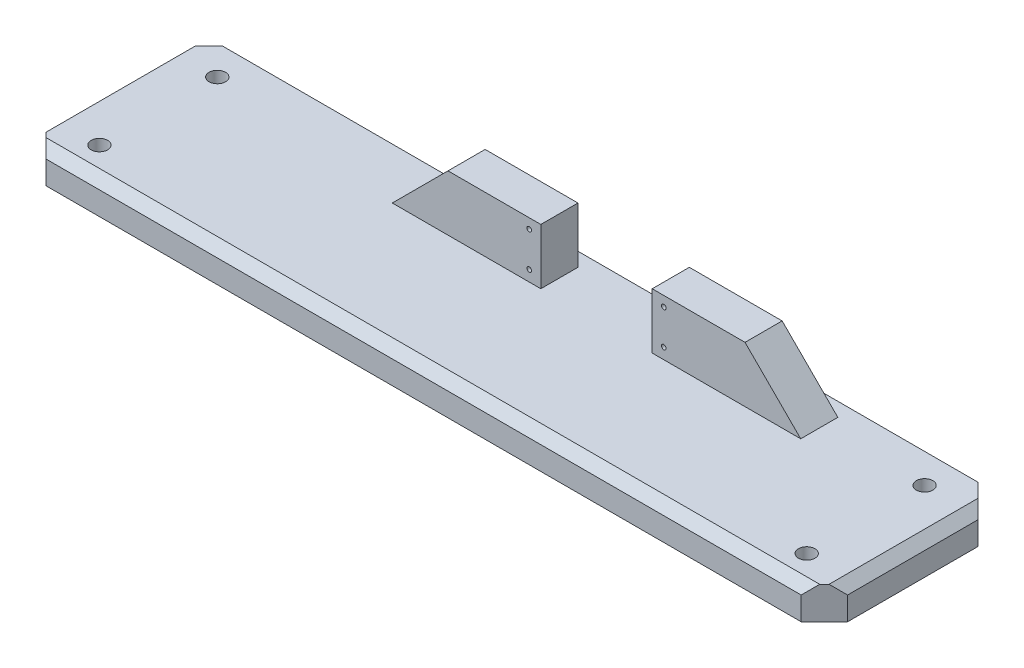
ISO-10303-21;
HEADER;
FILE_DESCRIPTION(('STEP AP214'),'2;1');
FILE_NAME('part.step','',(''),(''),'','','');
FILE_SCHEMA(('AUTOMOTIVE_DESIGN { 1 0 10303 214 1 1 1 1 }'));
ENDSEC;
DATA;
#1=APPLICATION_CONTEXT('core data for automotive mechanical design processes');
#2=APPLICATION_PROTOCOL_DEFINITION('international standard','automotive_design',2000,#1);
#3=PRODUCT_CONTEXT('',#1,'mechanical');
#4=PRODUCT('Part','Part','',(#3));
#5=PRODUCT_RELATED_PRODUCT_CATEGORY('part','',(#4));
#6=PRODUCT_DEFINITION_FORMATION('','',#4);
#7=PRODUCT_DEFINITION_CONTEXT('part definition',#1,'design');
#8=PRODUCT_DEFINITION('design','',#6,#7);
#9=PRODUCT_DEFINITION_SHAPE('','',#8);
#10=(LENGTH_UNIT() NAMED_UNIT(*) SI_UNIT(.MILLI.,.METRE.));
#11=(NAMED_UNIT(*) PLANE_ANGLE_UNIT() SI_UNIT($,.RADIAN.));
#12=(NAMED_UNIT(*) SI_UNIT($,.STERADIAN.) SOLID_ANGLE_UNIT());
#13=UNCERTAINTY_MEASURE_WITH_UNIT(LENGTH_MEASURE(1.E-05),#10,'distance_accuracy_value','');
#14=(GEOMETRIC_REPRESENTATION_CONTEXT(3) GLOBAL_UNCERTAINTY_ASSIGNED_CONTEXT((#13)) GLOBAL_UNIT_ASSIGNED_CONTEXT((#10,
#11,#12)) REPRESENTATION_CONTEXT('',''));
#15=CARTESIAN_POINT('',(0.,0.,0.));
#16=DIRECTION('',(0.,0.,1.));
#17=DIRECTION('',(1.,0.,0.));
#18=AXIS2_PLACEMENT_3D('',#15,#16,#17);
#19=CARTESIAN_POINT('',(0.,7.,0.));
#20=DIRECTION('',(0.,1.,0.));
#21=DIRECTION('',(0.,0.,1.));
#22=AXIS2_PLACEMENT_3D('',#19,#20,#21);
#23=PLANE('',#22);
#24=CARTESIAN_POINT('',(-69.0838657171923,7.,18.7476805696847));
#25=DIRECTION('',(0.,1.,0.));
#26=DIRECTION('',(0.,0.,1.));
#27=AXIS2_PLACEMENT_3D('',#24,#25,#26);
#28=CIRCLE('',#27,1.77800000000001);
#29=CARTESIAN_POINT('',(-69.0838657171923,7.,20.5256805696847));
#30=VERTEX_POINT('',#29);
#31=EDGE_CURVE('E218',#30,#30,#28,.T.);
#32=ORIENTED_EDGE('',*,*,#31,.F.);
#33=EDGE_LOOP('',(#32));
#34=FACE_BOUND('',#33,.T.);
#35=CARTESIAN_POINT('',(83.3161342828077,7.,-6.65231943031537));
#36=DIRECTION('',(0.,1.,0.));
#37=DIRECTION('',(0.,0.,1.));
#38=AXIS2_PLACEMENT_3D('',#35,#36,#37);
#39=CIRCLE('',#38,1.77800000000001);
#40=CARTESIAN_POINT('',(83.3161342828077,7.,-4.87431943031536));
#41=VERTEX_POINT('',#40);
#42=EDGE_CURVE('E222',#41,#41,#39,.T.);
#43=ORIENTED_EDGE('',*,*,#42,.F.);
#44=EDGE_LOOP('',(#43));
#45=FACE_BOUND('',#44,.T.);
#46=CARTESIAN_POINT('',(83.3161342828077,7.,18.7476805696846));
#47=DIRECTION('',(0.,1.,0.));
#48=DIRECTION('',(0.,0.,1.));
#49=AXIS2_PLACEMENT_3D('',#46,#47,#48);
#50=CIRCLE('',#49,1.77800000000001);
#51=CARTESIAN_POINT('',(83.3161342828077,7.,20.5256805696846));
#52=VERTEX_POINT('',#51);
#53=EDGE_CURVE('E217',#52,#52,#50,.T.);
#54=ORIENTED_EDGE('',*,*,#53,.F.);
#55=EDGE_LOOP('',(#54));
#56=FACE_BOUND('',#55,.T.);
#57=CARTESIAN_POINT('',(-69.0838657171923,7.,-6.65231943031536));
#58=DIRECTION('',(0.,1.,0.));
#59=DIRECTION('',(0.,0.,1.));
#60=AXIS2_PLACEMENT_3D('',#57,#58,#59);
#61=CIRCLE('',#60,1.77800000000001);
#62=CARTESIAN_POINT('',(-69.0838657171923,7.,-4.87431943031535));
#63=VERTEX_POINT('',#62);
#64=EDGE_CURVE('E227',#63,#63,#61,.T.);
#65=ORIENTED_EDGE('',*,*,#64,.F.);
#66=EDGE_LOOP('',(#65));
#67=FACE_BOUND('',#66,.T.);
#68=DIRECTION('',(0.,0.,-1.));
#69=VECTOR('',#68,1.);
#70=CARTESIAN_POINT('',(91.4761342828077,7.,-13.0023194303154));
#71=LINE('',#70,#69);
#72=CARTESIAN_POINT('',(91.4761342828077,7.,22.0976805696846));
#73=VERTEX_POINT('',#72);
#74=CARTESIAN_POINT('',(91.4761342828077,7.,-10.0023194303153));
#75=VERTEX_POINT('',#74);
#76=EDGE_CURVE('E276',#73,#75,#71,.T.);
#77=ORIENTED_EDGE('',*,*,#76,.T.);
#78=DIRECTION('',(0.707106781186546,0.,0.707106781186549));
#79=VECTOR('',#78,1.);
#80=CARTESIAN_POINT('',(50.7392268565618,7.,-50.7392268565615));
#81=LINE('',#80,#79);
#82=CARTESIAN_POINT('',(88.4761342828077,7.,-13.0023194303154));
#83=VERTEX_POINT('',#82);
#84=EDGE_CURVE('E315',#75,#83,#81,.F.);
#85=ORIENTED_EDGE('',*,*,#84,.T.);
#86=DIRECTION('',(-1.,0.,0.));
#87=VECTOR('',#86,1.);
#88=CARTESIAN_POINT('',(-79.2438657171923,7.,-13.0023194303154));
#89=LINE('',#88,#87);
#90=CARTESIAN_POINT('',(-74.2438657171923,7.,-13.0023194303154));
#91=VERTEX_POINT('',#90);
#92=EDGE_CURVE('E232',#83,#91,#89,.T.);
#93=ORIENTED_EDGE('',*,*,#92,.T.);
#94=DIRECTION('',(0.707106781186549,0.,-0.707106781186546));
#95=VECTOR('',#94,1.);
#96=CARTESIAN_POINT('',(-43.6230925737536,7.,-43.6230925737539));
#97=LINE('',#96,#95);
#98=CARTESIAN_POINT('',(-77.2438657171923,7.,-10.0023194303154));
#99=VERTEX_POINT('',#98);
#100=EDGE_CURVE('E309',#91,#99,#97,.F.);
#101=ORIENTED_EDGE('',*,*,#100,.T.);
#102=DIRECTION('',(0.,0.,1.));
#103=VECTOR('',#102,1.);
#104=CARTESIAN_POINT('',(-77.2438657171923,7.,25.0976805696846));
#105=LINE('',#104,#103);
#106=CARTESIAN_POINT('',(-77.2438657171923,7.,22.0976805696846));
#107=VERTEX_POINT('',#106);
#108=EDGE_CURVE('E273',#99,#107,#105,.T.);
#109=ORIENTED_EDGE('',*,*,#108,.T.);
#110=DIRECTION('',(-0.707106781186546,0.,-0.707106781186549));
#111=VECTOR('',#110,1.);
#112=CARTESIAN_POINT('',(-49.6707731434387,7.,49.6707731434384));
#113=LINE('',#112,#111);
#114=CARTESIAN_POINT('',(-76.2438657171923,7.,23.0976805696846));
#115=VERTEX_POINT('',#114);
#116=EDGE_CURVE('E311',#107,#115,#113,.F.);
#117=ORIENTED_EDGE('',*,*,#116,.T.);
#118=DIRECTION('',(1.,0.,0.));
#119=VECTOR('',#118,1.);
#120=CARTESIAN_POINT('',(93.4761342828077,7.,23.0976805696846));
#121=LINE('',#120,#119);
#122=CARTESIAN_POINT('',(90.4761342828077,7.,23.0976805696846));
#123=VERTEX_POINT('',#122);
#124=EDGE_CURVE('E270',#115,#123,#121,.T.);
#125=ORIENTED_EDGE('',*,*,#124,.T.);
#126=DIRECTION('',(-0.707106781186549,0.,0.707106781186546));
#127=VECTOR('',#126,1.);
#128=CARTESIAN_POINT('',(56.7869074262459,7.,56.7869074262462));
#129=LINE('',#128,#127);
#130=EDGE_CURVE('E313',#123,#73,#129,.F.);
#131=ORIENTED_EDGE('',*,*,#130,.T.);
#132=EDGE_LOOP('',(#77,#85,#93,#101,#109,#117,#125,#131));
#133=FACE_BOUND('',#132,.T.);
#134=DIRECTION('',(1.,0.,0.));
#135=VECTOR('',#134,1.);
#136=CARTESIAN_POINT('',(-14.7238657171923,7.,-2.00231943031536));
#137=LINE('',#136,#135);
#138=CARTESIAN_POINT('',(-26.7238657171923,7.,-2.00231943031536));
#139=VERTEX_POINT('',#138);
#140=CARTESIAN_POINT('',(5.27613428280772,7.,-2.00231943031536));
#141=VERTEX_POINT('',#140);
#142=EDGE_CURVE('E190',#139,#141,#137,.T.);
#143=ORIENTED_EDGE('',*,*,#142,.F.);
#144=DIRECTION('',(0.,0.,-1.));
#145=VECTOR('',#144,1.);
#146=CARTESIAN_POINT('',(-26.7238657171923,7.,0.));
#147=LINE('',#146,#145);
#148=CARTESIAN_POINT('',(-26.7238657171923,7.,-10.0023194303154));
#149=VERTEX_POINT('',#148);
#150=EDGE_CURVE('E235',#139,#149,#147,.T.);
#151=ORIENTED_EDGE('',*,*,#150,.T.);
#152=DIRECTION('',(-1.,0.,0.));
#153=VECTOR('',#152,1.);
#154=CARTESIAN_POINT('',(-14.7238657171923,7.,-10.0023194303154));
#155=LINE('',#154,#153);
#156=CARTESIAN_POINT('',(5.27613428280771,7.,-10.0023194303154));
#157=VERTEX_POINT('',#156);
#158=EDGE_CURVE('E202',#157,#149,#155,.T.);
#159=ORIENTED_EDGE('',*,*,#158,.F.);
#160=DIRECTION('',(0.,0.,-1.));
#161=VECTOR('',#160,1.);
#162=CARTESIAN_POINT('',(5.27613428280771,7.,-10.0023194303154));
#163=LINE('',#162,#161);
#164=EDGE_CURVE('E193',#141,#157,#163,.T.);
#165=ORIENTED_EDGE('',*,*,#164,.F.);
#166=EDGE_LOOP('',(#143,#151,#159,#165));
#167=FACE_BOUND('',#166,.T.);
#168=DIRECTION('',(-1.,0.,0.));
#169=VECTOR('',#168,1.);
#170=CARTESIAN_POINT('',(29.2761342828077,7.,-10.0023194303154));
#171=LINE('',#170,#169);
#172=CARTESIAN_POINT('',(61.2761342828077,7.,-10.0023194303154));
#173=VERTEX_POINT('',#172);
#174=CARTESIAN_POINT('',(29.2761342828077,7.,-10.0023194303154));
#175=VERTEX_POINT('',#174);
#176=EDGE_CURVE('E184',#173,#175,#171,.T.);
#177=ORIENTED_EDGE('',*,*,#176,.F.);
#178=DIRECTION('',(0.,0.,1.));
#179=VECTOR('',#178,1.);
#180=CARTESIAN_POINT('',(61.2761342828077,7.,0.));
#181=LINE('',#180,#179);
#182=CARTESIAN_POINT('',(61.2761342828077,7.,-2.00231943031536));
#183=VERTEX_POINT('',#182);
#184=EDGE_CURVE('E258',#173,#183,#181,.T.);
#185=ORIENTED_EDGE('',*,*,#184,.T.);
#186=DIRECTION('',(1.,0.,0.));
#187=VECTOR('',#186,1.);
#188=CARTESIAN_POINT('',(29.2761342828077,7.,-2.00231943031536));
#189=LINE('',#188,#187);
#190=CARTESIAN_POINT('',(29.2761342828077,7.,-2.00231943031536));
#191=VERTEX_POINT('',#190);
#192=EDGE_CURVE('E688',#191,#183,#189,.T.);
#193=ORIENTED_EDGE('',*,*,#192,.F.);
#194=DIRECTION('',(0.,0.,1.));
#195=VECTOR('',#194,1.);
#196=CARTESIAN_POINT('',(29.2761342828077,7.,-10.0023194303154));
#197=LINE('',#196,#195);
#198=EDGE_CURVE('E188',#175,#191,#197,.T.);
#199=ORIENTED_EDGE('',*,*,#198,.F.);
#200=EDGE_LOOP('',(#177,#185,#193,#199));
#201=FACE_BOUND('',#200,.T.);
#202=ADVANCED_FACE('F33',(#34,#45,#56,#67,#133,#167,#201),#23,.T.);
#203=CARTESIAN_POINT('',(-79.2438657171923,7.,-13.0023194303154));
#204=DIRECTION('',(1.,0.,0.));
#205=DIRECTION('',(0.,0.,-1.));
#206=AXIS2_PLACEMENT_3D('',#203,#204,#205);
#207=PLANE('',#206);
#208=DIRECTION('',(0.,0.,1.));
#209=VECTOR('',#208,1.);
#210=CARTESIAN_POINT('',(-79.2438657171923,0.,-13.0023194303154));
#211=LINE('',#210,#209);
#212=CARTESIAN_POINT('',(-79.2438657171923,0.,-8.00231943031538));
#213=VERTEX_POINT('',#212);
#214=CARTESIAN_POINT('',(-79.2438657171923,0.,20.0976805696846));
#215=VERTEX_POINT('',#214);
#216=EDGE_CURVE('E237',#213,#215,#211,.T.);
#217=ORIENTED_EDGE('',*,*,#216,.T.);
#218=DIRECTION('',(0.,1.,0.));
#219=VECTOR('',#218,1.);
#220=CARTESIAN_POINT('',(-79.2438657171923,7.,20.0976805696846));
#221=LINE('',#220,#219);
#222=CARTESIAN_POINT('',(-79.2438657171923,5.,20.0976805696846));
#223=VERTEX_POINT('',#222);
#224=EDGE_CURVE('E54',#215,#223,#221,.T.);
#225=ORIENTED_EDGE('',*,*,#224,.T.);
#226=DIRECTION('',(0.,0.,-1.));
#227=VECTOR('',#226,1.);
#228=CARTESIAN_POINT('',(-79.2438657171923,5.,-13.0023194303154));
#229=LINE('',#228,#227);
#230=CARTESIAN_POINT('',(-79.2438657171923,5.,-8.00231943031538));
#231=VERTEX_POINT('',#230);
#232=EDGE_CURVE('E282',#223,#231,#229,.T.);
#233=ORIENTED_EDGE('',*,*,#232,.T.);
#234=DIRECTION('',(0.,-1.,0.));
#235=VECTOR('',#234,1.);
#236=CARTESIAN_POINT('',(-79.2438657171923,7.,-8.00231943031538));
#237=LINE('',#236,#235);
#238=EDGE_CURVE('E326',#231,#213,#237,.T.);
#239=ORIENTED_EDGE('',*,*,#238,.T.);
#240=EDGE_LOOP('',(#217,#225,#233,#239));
#241=FACE_BOUND('',#240,.T.);
#242=ADVANCED_FACE('F331',(#241),#207,.F.);
#243=CARTESIAN_POINT('',(-79.2438657171923,7.,25.0976805696846));
#244=DIRECTION('',(0.,0.,-1.));
#245=DIRECTION('',(-1.,0.,0.));
#246=AXIS2_PLACEMENT_3D('',#243,#244,#245);
#247=PLANE('',#246);
#248=DIRECTION('',(1.,0.,0.));
#249=VECTOR('',#248,1.);
#250=CARTESIAN_POINT('',(-79.2438657171923,0.,25.0976805696846));
#251=LINE('',#250,#249);
#252=CARTESIAN_POINT('',(-74.2438657171923,0.,25.0976805696846));
#253=VERTEX_POINT('',#252);
#254=CARTESIAN_POINT('',(88.4761342828077,0.,25.0976805696846));
#255=VERTEX_POINT('',#254);
#256=EDGE_CURVE('E239',#253,#255,#251,.T.);
#257=ORIENTED_EDGE('',*,*,#256,.T.);
#258=DIRECTION('',(0.,1.,0.));
#259=VECTOR('',#258,1.);
#260=CARTESIAN_POINT('',(88.4761342828077,7.,25.0976805696846));
#261=LINE('',#260,#259);
#262=CARTESIAN_POINT('',(88.4761342828077,5.,25.0976805696846));
#263=VERTEX_POINT('',#262);
#264=EDGE_CURVE('E320',#255,#263,#261,.T.);
#265=ORIENTED_EDGE('',*,*,#264,.T.);
#266=DIRECTION('',(-1.,0.,0.));
#267=VECTOR('',#266,1.);
#268=CARTESIAN_POINT('',(-79.2438657171923,5.,25.0976805696846));
#269=LINE('',#268,#267);
#270=CARTESIAN_POINT('',(-74.2438657171923,5.,25.0976805696846));
#271=VERTEX_POINT('',#270);
#272=EDGE_CURVE('E284',#263,#271,#269,.T.);
#273=ORIENTED_EDGE('',*,*,#272,.T.);
#274=DIRECTION('',(0.,-1.,0.));
#275=VECTOR('',#274,1.);
#276=CARTESIAN_POINT('',(-74.2438657171923,7.,25.0976805696846));
#277=LINE('',#276,#275);
#278=EDGE_CURVE('E317',#271,#253,#277,.T.);
#279=ORIENTED_EDGE('',*,*,#278,.T.);
#280=EDGE_LOOP('',(#257,#265,#273,#279));
#281=FACE_BOUND('',#280,.T.);
#282=ADVANCED_FACE('F343',(#281),#247,.F.);
#283=CARTESIAN_POINT('',(93.4761342828077,7.,-13.0023194303154));
#284=DIRECTION('',(-1.,0.,0.));
#285=DIRECTION('',(0.,0.,1.));
#286=AXIS2_PLACEMENT_3D('',#283,#284,#285);
#287=PLANE('',#286);
#288=DIRECTION('',(0.,0.,-1.));
#289=VECTOR('',#288,1.);
#290=CARTESIAN_POINT('',(93.4761342828077,0.,-13.0023194303154));
#291=LINE('',#290,#289);
#292=CARTESIAN_POINT('',(93.4761342828077,0.,20.0976805696846));
#293=VERTEX_POINT('',#292);
#294=CARTESIAN_POINT('',(93.4761342828077,0.,-8.00231943031533));
#295=VERTEX_POINT('',#294);
#296=EDGE_CURVE('E242',#293,#295,#291,.T.);
#297=ORIENTED_EDGE('',*,*,#296,.T.);
#298=DIRECTION('',(0.,1.,0.));
#299=VECTOR('',#298,1.);
#300=CARTESIAN_POINT('',(93.4761342828077,7.,-8.00231943031533));
#301=LINE('',#300,#299);
#302=CARTESIAN_POINT('',(93.4761342828077,5.,-8.00231943031533));
#303=VERTEX_POINT('',#302);
#304=EDGE_CURVE('E303',#295,#303,#301,.T.);
#305=ORIENTED_EDGE('',*,*,#304,.T.);
#306=DIRECTION('',(0.,0.,1.));
#307=VECTOR('',#306,1.);
#308=CARTESIAN_POINT('',(93.4761342828077,5.,25.0976805696846));
#309=LINE('',#308,#307);
#310=CARTESIAN_POINT('',(93.4761342828077,5.,20.0976805696846));
#311=VERTEX_POINT('',#310);
#312=EDGE_CURVE('E279',#303,#311,#309,.T.);
#313=ORIENTED_EDGE('',*,*,#312,.T.);
#314=DIRECTION('',(0.,-1.,0.));
#315=VECTOR('',#314,1.);
#316=CARTESIAN_POINT('',(93.4761342828077,7.,20.0976805696846));
#317=LINE('',#316,#315);
#318=EDGE_CURVE('E300',#311,#293,#317,.T.);
#319=ORIENTED_EDGE('',*,*,#318,.T.);
#320=EDGE_LOOP('',(#297,#305,#313,#319));
#321=FACE_BOUND('',#320,.T.);
#322=ADVANCED_FACE('F404',(#321),#287,.F.);
#323=CARTESIAN_POINT('',(-79.2438657171923,7.,-13.0023194303154));
#324=DIRECTION('',(0.,0.,1.));
#325=DIRECTION('',(1.,0.,0.));
#326=AXIS2_PLACEMENT_3D('',#323,#324,#325);
#327=PLANE('',#326);
#328=ORIENTED_EDGE('',*,*,#92,.F.);
#329=DIRECTION('',(0.,-1.,0.));
#330=VECTOR('',#329,1.);
#331=CARTESIAN_POINT('',(88.4761342828077,7.,-13.0023194303154));
#332=LINE('',#331,#330);
#333=CARTESIAN_POINT('',(88.4761342828077,0.,-13.0023194303154));
#334=VERTEX_POINT('',#333);
#335=EDGE_CURVE('E289',#83,#334,#332,.T.);
#336=ORIENTED_EDGE('',*,*,#335,.T.);
#337=DIRECTION('',(-1.,0.,0.));
#338=VECTOR('',#337,1.);
#339=CARTESIAN_POINT('',(-79.2438657171923,0.,-13.0023194303154));
#340=LINE('',#339,#338);
#341=CARTESIAN_POINT('',(-74.2438657171923,0.,-13.0023194303154));
#342=VERTEX_POINT('',#341);
#343=EDGE_CURVE('E236',#334,#342,#340,.T.);
#344=ORIENTED_EDGE('',*,*,#343,.T.);
#345=DIRECTION('',(0.,1.,0.));
#346=VECTOR('',#345,1.);
#347=CARTESIAN_POINT('',(-74.2438657171923,7.,-13.0023194303154));
#348=LINE('',#347,#346);
#349=EDGE_CURVE('E287',#342,#91,#348,.T.);
#350=ORIENTED_EDGE('',*,*,#349,.T.);
#351=EDGE_LOOP('',(#328,#336,#344,#350));
#352=FACE_BOUND('',#351,.T.);
#353=ADVANCED_FACE('F370',(#352),#327,.F.);
#354=CARTESIAN_POINT('',(0.,0.,0.));
#355=DIRECTION('',(0.,1.,0.));
#356=DIRECTION('',(0.,0.,1.));
#357=AXIS2_PLACEMENT_3D('',#354,#355,#356);
#358=PLANE('',#357);
#359=CARTESIAN_POINT('',(-69.0838657171923,0.,18.7476805696847));
#360=DIRECTION('',(0.,1.,0.));
#361=DIRECTION('',(0.,0.,1.));
#362=AXIS2_PLACEMENT_3D('',#359,#360,#361);
#363=CIRCLE('',#362,1.77800000000001);
#364=CARTESIAN_POINT('',(-69.0838657171923,0.,20.5256805696847));
#365=VERTEX_POINT('',#364);
#366=EDGE_CURVE('E231',#365,#365,#363,.T.);
#367=ORIENTED_EDGE('',*,*,#366,.T.);
#368=EDGE_LOOP('',(#367));
#369=FACE_BOUND('',#368,.T.);
#370=CARTESIAN_POINT('',(83.3161342828077,0.,-6.65231943031537));
#371=DIRECTION('',(0.,1.,0.));
#372=DIRECTION('',(0.,0.,1.));
#373=AXIS2_PLACEMENT_3D('',#370,#371,#372);
#374=CIRCLE('',#373,1.77800000000001);
#375=CARTESIAN_POINT('',(83.3161342828077,0.,-4.87431943031536));
#376=VERTEX_POINT('',#375);
#377=EDGE_CURVE('E251',#376,#376,#374,.T.);
#378=ORIENTED_EDGE('',*,*,#377,.T.);
#379=EDGE_LOOP('',(#378));
#380=FACE_BOUND('',#379,.T.);
#381=CARTESIAN_POINT('',(83.3161342828077,0.,18.7476805696846));
#382=DIRECTION('',(0.,1.,0.));
#383=DIRECTION('',(0.,0.,1.));
#384=AXIS2_PLACEMENT_3D('',#381,#382,#383);
#385=CIRCLE('',#384,1.77800000000001);
#386=CARTESIAN_POINT('',(83.3161342828077,0.,20.5256805696846));
#387=VERTEX_POINT('',#386);
#388=EDGE_CURVE('E221',#387,#387,#385,.T.);
#389=ORIENTED_EDGE('',*,*,#388,.T.);
#390=EDGE_LOOP('',(#389));
#391=FACE_BOUND('',#390,.T.);
#392=CARTESIAN_POINT('',(-69.0838657171923,0.,-6.65231943031536));
#393=DIRECTION('',(0.,1.,0.));
#394=DIRECTION('',(0.,0.,1.));
#395=AXIS2_PLACEMENT_3D('',#392,#393,#394);
#396=CIRCLE('',#395,1.77800000000001);
#397=CARTESIAN_POINT('',(-69.0838657171923,0.,-4.87431943031535));
#398=VERTEX_POINT('',#397);
#399=EDGE_CURVE('E230',#398,#398,#396,.T.);
#400=ORIENTED_EDGE('',*,*,#399,.T.);
#401=EDGE_LOOP('',(#400));
#402=FACE_BOUND('',#401,.T.);
#403=ORIENTED_EDGE('',*,*,#343,.F.);
#404=DIRECTION('',(-0.707106781186546,0.,-0.707106781186549));
#405=VECTOR('',#404,1.);
#406=CARTESIAN_POINT('',(88.4761342828077,0.,-13.0023194303154));
#407=LINE('',#406,#405);
#408=EDGE_CURVE('E298',#334,#295,#407,.F.);
#409=ORIENTED_EDGE('',*,*,#408,.T.);
#410=ORIENTED_EDGE('',*,*,#296,.F.);
#411=DIRECTION('',(0.707106781186549,0.,-0.707106781186546));
#412=VECTOR('',#411,1.);
#413=CARTESIAN_POINT('',(93.4761342828077,0.,20.0976805696846));
#414=LINE('',#413,#412);
#415=EDGE_CURVE('E296',#293,#255,#414,.F.);
#416=ORIENTED_EDGE('',*,*,#415,.T.);
#417=ORIENTED_EDGE('',*,*,#256,.F.);
#418=DIRECTION('',(0.707106781186546,0.,0.707106781186549));
#419=VECTOR('',#418,1.);
#420=CARTESIAN_POINT('',(-74.2438657171923,0.,25.0976805696846));
#421=LINE('',#420,#419);
#422=EDGE_CURVE('E294',#253,#215,#421,.F.);
#423=ORIENTED_EDGE('',*,*,#422,.T.);
#424=ORIENTED_EDGE('',*,*,#216,.F.);
#425=DIRECTION('',(-0.707106781186549,0.,0.707106781186546));
#426=VECTOR('',#425,1.);
#427=CARTESIAN_POINT('',(-79.2438657171923,0.,-8.00231943031538));
#428=LINE('',#427,#426);
#429=EDGE_CURVE('E292',#213,#342,#428,.F.);
#430=ORIENTED_EDGE('',*,*,#429,.T.);
#431=EDGE_LOOP('',(#403,#409,#410,#416,#417,#423,#424,#430));
#432=FACE_BOUND('',#431,.T.);
#433=ADVANCED_FACE('F335',(#369,#380,#391,#402,#432),#358,.F.);
#434=CARTESIAN_POINT('',(-69.0838657171923,-10.,-6.65231943031536));
#435=DIRECTION('',(0.,1.,0.));
#436=DIRECTION('',(0.,0.,1.));
#437=AXIS2_PLACEMENT_3D('',#434,#435,#436);
#438=CYLINDRICAL_SURFACE('',#437,1.77800000000001);
#439=ORIENTED_EDGE('',*,*,#64,.T.);
#440=EDGE_LOOP('',(#439));
#441=FACE_BOUND('',#440,.T.);
#442=ORIENTED_EDGE('',*,*,#399,.F.);
#443=EDGE_LOOP('',(#442));
#444=FACE_BOUND('',#443,.T.);
#445=ADVANCED_FACE('F397',(#441,#444),#438,.F.);
#446=CARTESIAN_POINT('',(83.3161342828077,-10.,18.7476805696846));
#447=DIRECTION('',(0.,1.,0.));
#448=DIRECTION('',(0.,0.,1.));
#449=AXIS2_PLACEMENT_3D('',#446,#447,#448);
#450=CYLINDRICAL_SURFACE('',#449,1.77800000000001);
#451=ORIENTED_EDGE('',*,*,#53,.T.);
#452=EDGE_LOOP('',(#451));
#453=FACE_BOUND('',#452,.T.);
#454=ORIENTED_EDGE('',*,*,#388,.F.);
#455=EDGE_LOOP('',(#454));
#456=FACE_BOUND('',#455,.T.);
#457=ADVANCED_FACE('F638',(#453,#456),#450,.F.);
#458=CARTESIAN_POINT('',(83.3161342828077,-10.,-6.65231943031537));
#459=DIRECTION('',(0.,1.,0.));
#460=DIRECTION('',(0.,0.,1.));
#461=AXIS2_PLACEMENT_3D('',#458,#459,#460);
#462=CYLINDRICAL_SURFACE('',#461,1.77800000000001);
#463=ORIENTED_EDGE('',*,*,#42,.T.);
#464=EDGE_LOOP('',(#463));
#465=FACE_BOUND('',#464,.T.);
#466=ORIENTED_EDGE('',*,*,#377,.F.);
#467=EDGE_LOOP('',(#466));
#468=FACE_BOUND('',#467,.T.);
#469=ADVANCED_FACE('F628',(#465,#468),#462,.F.);
#470=CARTESIAN_POINT('',(-69.0838657171923,-10.,18.7476805696847));
#471=DIRECTION('',(0.,1.,0.));
#472=DIRECTION('',(0.,0.,1.));
#473=AXIS2_PLACEMENT_3D('',#470,#471,#472);
#474=CYLINDRICAL_SURFACE('',#473,1.77800000000001);
#475=ORIENTED_EDGE('',*,*,#31,.T.);
#476=EDGE_LOOP('',(#475));
#477=FACE_BOUND('',#476,.T.);
#478=ORIENTED_EDGE('',*,*,#366,.F.);
#479=EDGE_LOOP('',(#478));
#480=FACE_BOUND('',#479,.T.);
#481=ADVANCED_FACE('F572',(#477,#480),#474,.F.);
#482=CARTESIAN_POINT('',(-14.7238657171923,19.,-2.00231943031536));
#483=DIRECTION('',(0.,0.,-1.));
#484=DIRECTION('',(-1.,0.,0.));
#485=AXIS2_PLACEMENT_3D('',#482,#483,#484);
#486=PLANE('',#485);
#487=CARTESIAN_POINT('',(2.77613428280771,9.35,-2.00231943031536));
#488=DIRECTION('',(0.,0.,-1.));
#489=DIRECTION('',(-1.,0.,0.));
#490=AXIS2_PLACEMENT_3D('',#487,#488,#489);
#491=CIRCLE('',#490,0.500000000000001);
#492=CARTESIAN_POINT('',(2.27613428280771,9.35,-2.00231943031536));
#493=VERTEX_POINT('',#492);
#494=EDGE_CURVE('E700',#493,#493,#491,.T.);
#495=ORIENTED_EDGE('',*,*,#494,.T.);
#496=EDGE_LOOP('',(#495));
#497=FACE_BOUND('',#496,.T.);
#498=CARTESIAN_POINT('',(2.77613428280771,16.85,-2.00231943031536));
#499=DIRECTION('',(0.,0.,-1.));
#500=DIRECTION('',(-1.,0.,0.));
#501=AXIS2_PLACEMENT_3D('',#498,#499,#500);
#502=CIRCLE('',#501,0.500000000000001);
#503=CARTESIAN_POINT('',(2.27613428280771,16.85,-2.00231943031536));
#504=VERTEX_POINT('',#503);
#505=EDGE_CURVE('E705',#504,#504,#502,.T.);
#506=ORIENTED_EDGE('',*,*,#505,.T.);
#507=EDGE_LOOP('',(#506));
#508=FACE_BOUND('',#507,.T.);
#509=ORIENTED_EDGE('',*,*,#142,.T.);
#510=DIRECTION('',(0.,-1.,0.));
#511=VECTOR('',#510,1.);
#512=CARTESIAN_POINT('',(5.27613428280772,19.,-2.00231943031536));
#513=LINE('',#512,#511);
#514=CARTESIAN_POINT('',(5.27613428280772,19.,-2.00231943031536));
#515=VERTEX_POINT('',#514);
#516=EDGE_CURVE('E214',#515,#141,#513,.T.);
#517=ORIENTED_EDGE('',*,*,#516,.F.);
#518=DIRECTION('',(1.,0.,0.));
#519=VECTOR('',#518,1.);
#520=CARTESIAN_POINT('',(-14.7238657171923,19.,-2.00231943031536));
#521=LINE('',#520,#519);
#522=CARTESIAN_POINT('',(-14.7238657171923,19.,-2.00231943031536));
#523=VERTEX_POINT('',#522);
#524=EDGE_CURVE('E201',#523,#515,#521,.T.);
#525=ORIENTED_EDGE('',*,*,#524,.F.);
#526=DIRECTION('',(-0.707106781186543,-0.707106781186552,0.));
#527=VECTOR('',#526,1.);
#528=CARTESIAN_POINT('',(-14.7238657171923,19.0000000000001,-2.00231943031536));
#529=LINE('',#528,#527);
#530=EDGE_CURVE('E265',#523,#139,#529,.T.);
#531=ORIENTED_EDGE('',*,*,#530,.T.);
#532=EDGE_LOOP('',(#509,#517,#525,#531));
#533=FACE_BOUND('',#532,.T.);
#534=ADVANCED_FACE('F568',(#497,#508,#533),#486,.F.);
#535=CARTESIAN_POINT('',(5.27613428280771,19.,-10.0023194303154));
#536=DIRECTION('',(-1.,0.,0.));
#537=DIRECTION('',(0.,0.,1.));
#538=AXIS2_PLACEMENT_3D('',#535,#536,#537);
#539=PLANE('',#538);
#540=ORIENTED_EDGE('',*,*,#164,.T.);
#541=DIRECTION('',(0.,-1.,0.));
#542=VECTOR('',#541,1.);
#543=CARTESIAN_POINT('',(5.27613428280771,19.,-10.0023194303154));
#544=LINE('',#543,#542);
#545=CARTESIAN_POINT('',(5.27613428280771,19.,-10.0023194303154));
#546=VERTEX_POINT('',#545);
#547=EDGE_CURVE('E208',#546,#157,#544,.T.);
#548=ORIENTED_EDGE('',*,*,#547,.F.);
#549=DIRECTION('',(0.,0.,-1.));
#550=VECTOR('',#549,1.);
#551=CARTESIAN_POINT('',(5.27613428280771,19.,-10.0023194303154));
#552=LINE('',#551,#550);
#553=EDGE_CURVE('E204',#515,#546,#552,.T.);
#554=ORIENTED_EDGE('',*,*,#553,.F.);
#555=ORIENTED_EDGE('',*,*,#516,.T.);
#556=EDGE_LOOP('',(#540,#548,#554,#555));
#557=FACE_BOUND('',#556,.T.);
#558=ADVANCED_FACE('F560',(#557),#539,.F.);
#559=CARTESIAN_POINT('',(-14.7238657171923,19.,-10.0023194303154));
#560=DIRECTION('',(0.,0.,1.));
#561=DIRECTION('',(1.,0.,0.));
#562=AXIS2_PLACEMENT_3D('',#559,#560,#561);
#563=PLANE('',#562);
#564=CARTESIAN_POINT('',(2.77613428280771,9.35,-10.0023194303154));
#565=DIRECTION('',(0.,0.,-1.));
#566=DIRECTION('',(-1.,0.,0.));
#567=AXIS2_PLACEMENT_3D('',#564,#565,#566);
#568=CIRCLE('',#567,0.500000000000001);
#569=CARTESIAN_POINT('',(2.27613428280771,9.35,-10.0023194303154));
#570=VERTEX_POINT('',#569);
#571=EDGE_CURVE('E715',#570,#570,#568,.T.);
#572=ORIENTED_EDGE('',*,*,#571,.F.);
#573=EDGE_LOOP('',(#572));
#574=FACE_BOUND('',#573,.T.);
#575=CARTESIAN_POINT('',(2.77613428280771,16.85,-10.0023194303154));
#576=DIRECTION('',(0.,0.,-1.));
#577=DIRECTION('',(-1.,0.,0.));
#578=AXIS2_PLACEMENT_3D('',#575,#576,#577);
#579=CIRCLE('',#578,0.500000000000001);
#580=CARTESIAN_POINT('',(2.27613428280771,16.85,-10.0023194303154));
#581=VERTEX_POINT('',#580);
#582=EDGE_CURVE('E712',#581,#581,#579,.T.);
#583=ORIENTED_EDGE('',*,*,#582,.F.);
#584=EDGE_LOOP('',(#583));
#585=FACE_BOUND('',#584,.T.);
#586=ORIENTED_EDGE('',*,*,#158,.T.);
#587=DIRECTION('',(0.707106781186543,0.707106781186552,0.));
#588=VECTOR('',#587,1.);
#589=CARTESIAN_POINT('',(-14.7238657171923,19.0000000000001,-10.0023194303154));
#590=LINE('',#589,#588);
#591=CARTESIAN_POINT('',(-14.7238657171923,19.,-10.0023194303154));
#592=VERTEX_POINT('',#591);
#593=EDGE_CURVE('E268',#149,#592,#590,.T.);
#594=ORIENTED_EDGE('',*,*,#593,.T.);
#595=DIRECTION('',(-1.,0.,0.));
#596=VECTOR('',#595,1.);
#597=CARTESIAN_POINT('',(-14.7238657171923,19.,-10.0023194303154));
#598=LINE('',#597,#596);
#599=EDGE_CURVE('E206',#546,#592,#598,.T.);
#600=ORIENTED_EDGE('',*,*,#599,.F.);
#601=ORIENTED_EDGE('',*,*,#547,.T.);
#602=EDGE_LOOP('',(#586,#594,#600,#601));
#603=FACE_BOUND('',#602,.T.);
#604=ADVANCED_FACE('F550',(#574,#585,#603),#563,.F.);
#605=CARTESIAN_POINT('',(0.,19.,0.));
#606=DIRECTION('',(0.,1.,0.));
#607=DIRECTION('',(0.,0.,1.));
#608=AXIS2_PLACEMENT_3D('',#605,#606,#607);
#609=PLANE('',#608);
#610=DIRECTION('',(0.,0.,1.));
#611=VECTOR('',#610,1.);
#612=CARTESIAN_POINT('',(-14.7238657171923,19.,-10.0023194303154));
#613=LINE('',#612,#611);
#614=EDGE_CURVE('E198',#592,#523,#613,.T.);
#615=ORIENTED_EDGE('',*,*,#614,.T.);
#616=ORIENTED_EDGE('',*,*,#524,.T.);
#617=ORIENTED_EDGE('',*,*,#553,.T.);
#618=ORIENTED_EDGE('',*,*,#599,.T.);
#619=EDGE_LOOP('',(#615,#616,#617,#618));
#620=FACE_BOUND('',#619,.T.);
#621=ADVANCED_FACE('F545',(#620),#609,.T.);
#622=CARTESIAN_POINT('',(29.2761342828077,19.,-10.0023194303154));
#623=DIRECTION('',(1.,0.,0.));
#624=DIRECTION('',(0.,0.,-1.));
#625=AXIS2_PLACEMENT_3D('',#622,#623,#624);
#626=PLANE('',#625);
#627=ORIENTED_EDGE('',*,*,#198,.T.);
#628=DIRECTION('',(0.,-1.,0.));
#629=VECTOR('',#628,1.);
#630=CARTESIAN_POINT('',(29.2761342828077,19.,-2.00231943031536));
#631=LINE('',#630,#629);
#632=CARTESIAN_POINT('',(29.2761342828077,19.,-2.00231943031536));
#633=VERTEX_POINT('',#632);
#634=EDGE_CURVE('E167',#633,#191,#631,.T.);
#635=ORIENTED_EDGE('',*,*,#634,.F.);
#636=DIRECTION('',(0.,0.,1.));
#637=VECTOR('',#636,1.);
#638=CARTESIAN_POINT('',(29.2761342828077,19.,-10.0023194303154));
#639=LINE('',#638,#637);
#640=CARTESIAN_POINT('',(29.2761342828077,19.,-10.0023194303154));
#641=VERTEX_POINT('',#640);
#642=EDGE_CURVE('E175',#641,#633,#639,.T.);
#643=ORIENTED_EDGE('',*,*,#642,.F.);
#644=DIRECTION('',(0.,-1.,0.));
#645=VECTOR('',#644,1.);
#646=CARTESIAN_POINT('',(29.2761342828077,19.,-10.0023194303154));
#647=LINE('',#646,#645);
#648=EDGE_CURVE('E191',#641,#175,#647,.T.);
#649=ORIENTED_EDGE('',*,*,#648,.T.);
#650=EDGE_LOOP('',(#627,#635,#643,#649));
#651=FACE_BOUND('',#650,.T.);
#652=ADVANCED_FACE('F186',(#651),#626,.F.);
#653=CARTESIAN_POINT('',(29.2761342828077,19.,-2.00231943031536));
#654=DIRECTION('',(0.,0.,-1.));
#655=DIRECTION('',(-1.,0.,0.));
#656=AXIS2_PLACEMENT_3D('',#653,#654,#655);
#657=PLANE('',#656);
#658=CARTESIAN_POINT('',(31.7761342828077,9.35,-2.00231943031536));
#659=DIRECTION('',(0.,0.,-1.));
#660=DIRECTION('',(-1.,0.,0.));
#661=AXIS2_PLACEMENT_3D('',#658,#659,#660);
#662=CIRCLE('',#661,0.499999999999999);
#663=CARTESIAN_POINT('',(31.2761342828077,9.35,-2.00231943031536));
#664=VERTEX_POINT('',#663);
#665=EDGE_CURVE('E708',#664,#664,#662,.T.);
#666=ORIENTED_EDGE('',*,*,#665,.T.);
#667=EDGE_LOOP('',(#666));
#668=FACE_BOUND('',#667,.T.);
#669=CARTESIAN_POINT('',(31.7761342828077,16.85,-2.00231943031536));
#670=DIRECTION('',(0.,0.,-1.));
#671=DIRECTION('',(-1.,0.,0.));
#672=AXIS2_PLACEMENT_3D('',#669,#670,#671);
#673=CIRCLE('',#672,0.499999999999999);
#674=CARTESIAN_POINT('',(31.2761342828077,16.85,-2.00231943031536));
#675=VERTEX_POINT('',#674);
#676=EDGE_CURVE('E693',#675,#675,#673,.T.);
#677=ORIENTED_EDGE('',*,*,#676,.T.);
#678=EDGE_LOOP('',(#677));
#679=FACE_BOUND('',#678,.T.);
#680=ORIENTED_EDGE('',*,*,#192,.T.);
#681=DIRECTION('',(-0.707106781186543,0.707106781186552,0.));
#682=VECTOR('',#681,1.);
#683=CARTESIAN_POINT('',(39.2761342828079,29.0000000000001,-2.00231943031536));
#684=LINE('',#683,#682);
#685=CARTESIAN_POINT('',(49.2761342828077,19.,-2.00231943031536));
#686=VERTEX_POINT('',#685);
#687=EDGE_CURVE('E170',#183,#686,#684,.T.);
#688=ORIENTED_EDGE('',*,*,#687,.T.);
#689=DIRECTION('',(1.,0.,0.));
#690=VECTOR('',#689,1.);
#691=CARTESIAN_POINT('',(29.2761342828077,19.,-2.00231943031536));
#692=LINE('',#691,#690);
#693=EDGE_CURVE('E163',#633,#686,#692,.T.);
#694=ORIENTED_EDGE('',*,*,#693,.F.);
#695=ORIENTED_EDGE('',*,*,#634,.T.);
#696=EDGE_LOOP('',(#680,#688,#694,#695));
#697=FACE_BOUND('',#696,.T.);
#698=ADVANCED_FACE('F165',(#668,#679,#697),#657,.F.);
#699=CARTESIAN_POINT('',(29.2761342828077,19.,-10.0023194303154));
#700=DIRECTION('',(0.,0.,1.));
#701=DIRECTION('',(1.,0.,0.));
#702=AXIS2_PLACEMENT_3D('',#699,#700,#701);
#703=PLANE('',#702);
#704=CARTESIAN_POINT('',(31.7761342828077,9.35,-10.0023194303154));
#705=DIRECTION('',(0.,0.,-1.));
#706=DIRECTION('',(-1.,0.,0.));
#707=AXIS2_PLACEMENT_3D('',#704,#705,#706);
#708=CIRCLE('',#707,0.499999999999999);
#709=CARTESIAN_POINT('',(31.2761342828077,9.35,-10.0023194303154));
#710=VERTEX_POINT('',#709);
#711=EDGE_CURVE('E711',#710,#710,#708,.T.);
#712=ORIENTED_EDGE('',*,*,#711,.F.);
#713=EDGE_LOOP('',(#712));
#714=FACE_BOUND('',#713,.T.);
#715=CARTESIAN_POINT('',(31.7761342828077,16.85,-10.0023194303154));
#716=DIRECTION('',(0.,0.,-1.));
#717=DIRECTION('',(-1.,0.,0.));
#718=AXIS2_PLACEMENT_3D('',#715,#716,#717);
#719=CIRCLE('',#718,0.499999999999999);
#720=CARTESIAN_POINT('',(31.2761342828077,16.85,-10.0023194303154));
#721=VERTEX_POINT('',#720);
#722=EDGE_CURVE('E695',#721,#721,#719,.T.);
#723=ORIENTED_EDGE('',*,*,#722,.F.);
#724=EDGE_LOOP('',(#723));
#725=FACE_BOUND('',#724,.T.);
#726=ORIENTED_EDGE('',*,*,#176,.T.);
#727=ORIENTED_EDGE('',*,*,#648,.F.);
#728=DIRECTION('',(-1.,0.,0.));
#729=VECTOR('',#728,1.);
#730=CARTESIAN_POINT('',(29.2761342828077,19.,-10.0023194303154));
#731=LINE('',#730,#729);
#732=CARTESIAN_POINT('',(49.2761342828077,19.,-10.0023194303154));
#733=VERTEX_POINT('',#732);
#734=EDGE_CURVE('E180',#733,#641,#731,.T.);
#735=ORIENTED_EDGE('',*,*,#734,.F.);
#736=DIRECTION('',(0.707106781186543,-0.707106781186552,0.));
#737=VECTOR('',#736,1.);
#738=CARTESIAN_POINT('',(39.2761342828079,29.0000000000001,-10.0023194303154));
#739=LINE('',#738,#737);
#740=EDGE_CURVE('E261',#733,#173,#739,.T.);
#741=ORIENTED_EDGE('',*,*,#740,.T.);
#742=EDGE_LOOP('',(#726,#727,#735,#741));
#743=FACE_BOUND('',#742,.T.);
#744=ADVANCED_FACE('F518',(#714,#725,#743),#703,.F.);
#745=CARTESIAN_POINT('',(0.,19.,0.));
#746=DIRECTION('',(0.,1.,0.));
#747=DIRECTION('',(0.,0.,1.));
#748=AXIS2_PLACEMENT_3D('',#745,#746,#747);
#749=PLANE('',#748);
#750=ORIENTED_EDGE('',*,*,#642,.T.);
#751=ORIENTED_EDGE('',*,*,#693,.T.);
#752=DIRECTION('',(0.,0.,-1.));
#753=VECTOR('',#752,1.);
#754=CARTESIAN_POINT('',(49.2761342828077,19.,-10.0023194303154));
#755=LINE('',#754,#753);
#756=EDGE_CURVE('E174',#686,#733,#755,.T.);
#757=ORIENTED_EDGE('',*,*,#756,.T.);
#758=ORIENTED_EDGE('',*,*,#734,.T.);
#759=EDGE_LOOP('',(#750,#751,#757,#758));
#760=FACE_BOUND('',#759,.T.);
#761=ADVANCED_FACE('F178',(#760),#749,.T.);
#762=CARTESIAN_POINT('',(31.7761342828077,16.85,-0.00231943031535863));
#763=DIRECTION('',(0.,0.,-1.));
#764=DIRECTION('',(-1.,0.,0.));
#765=AXIS2_PLACEMENT_3D('',#762,#763,#764);
#766=CYLINDRICAL_SURFACE('',#765,0.499999999999999);
#767=ORIENTED_EDGE('',*,*,#722,.T.);
#768=EDGE_LOOP('',(#767));
#769=FACE_BOUND('',#768,.T.);
#770=ORIENTED_EDGE('',*,*,#676,.F.);
#771=EDGE_LOOP('',(#770));
#772=FACE_BOUND('',#771,.T.);
#773=ADVANCED_FACE('F517',(#769,#772),#766,.F.);
#774=CARTESIAN_POINT('',(31.7761342828077,9.35,-0.00231943031535863));
#775=DIRECTION('',(0.,0.,-1.));
#776=DIRECTION('',(-1.,0.,0.));
#777=AXIS2_PLACEMENT_3D('',#774,#775,#776);
#778=CYLINDRICAL_SURFACE('',#777,0.499999999999999);
#779=ORIENTED_EDGE('',*,*,#711,.T.);
#780=EDGE_LOOP('',(#779));
#781=FACE_BOUND('',#780,.T.);
#782=ORIENTED_EDGE('',*,*,#665,.F.);
#783=EDGE_LOOP('',(#782));
#784=FACE_BOUND('',#783,.T.);
#785=ADVANCED_FACE('F591',(#781,#784),#778,.F.);
#786=CARTESIAN_POINT('',(2.77613428280771,16.85,-0.00231943031535863));
#787=DIRECTION('',(0.,0.,-1.));
#788=DIRECTION('',(-1.,0.,0.));
#789=AXIS2_PLACEMENT_3D('',#786,#787,#788);
#790=CYLINDRICAL_SURFACE('',#789,0.500000000000001);
#791=ORIENTED_EDGE('',*,*,#582,.T.);
#792=EDGE_LOOP('',(#791));
#793=FACE_BOUND('',#792,.T.);
#794=ORIENTED_EDGE('',*,*,#505,.F.);
#795=EDGE_LOOP('',(#794));
#796=FACE_BOUND('',#795,.T.);
#797=ADVANCED_FACE('F581',(#793,#796),#790,.F.);
#798=CARTESIAN_POINT('',(2.77613428280771,9.35,-0.00231943031535863));
#799=DIRECTION('',(0.,0.,-1.));
#800=DIRECTION('',(-1.,0.,0.));
#801=AXIS2_PLACEMENT_3D('',#798,#799,#800);
#802=CYLINDRICAL_SURFACE('',#801,0.500000000000001);
#803=ORIENTED_EDGE('',*,*,#571,.T.);
#804=EDGE_LOOP('',(#803));
#805=FACE_BOUND('',#804,.T.);
#806=ORIENTED_EDGE('',*,*,#494,.F.);
#807=EDGE_LOOP('',(#806));
#808=FACE_BOUND('',#807,.T.);
#809=ADVANCED_FACE('F411',(#805,#808),#802,.F.);
#810=CARTESIAN_POINT('',(49.2761342828077,19.0000000000001,-10.0023194303154));
#811=DIRECTION('',(-0.707106781186552,-0.707106781186543,0.));
#812=DIRECTION('',(0.,0.,-1.));
#813=AXIS2_PLACEMENT_3D('',#810,#811,#812);
#814=PLANE('',#813);
#815=ORIENTED_EDGE('',*,*,#687,.F.);
#816=ORIENTED_EDGE('',*,*,#184,.F.);
#817=ORIENTED_EDGE('',*,*,#740,.F.);
#818=ORIENTED_EDGE('',*,*,#756,.F.);
#819=EDGE_LOOP('',(#815,#816,#817,#818));
#820=FACE_BOUND('',#819,.T.);
#821=ADVANCED_FACE('F382',(#820),#814,.F.);
#822=CARTESIAN_POINT('',(-14.7238657171923,19.0000000000001,-10.0023194303154));
#823=DIRECTION('',(0.707106781186552,-0.707106781186543,0.));
#824=DIRECTION('',(0.,0.,1.));
#825=AXIS2_PLACEMENT_3D('',#822,#823,#824);
#826=PLANE('',#825);
#827=ORIENTED_EDGE('',*,*,#593,.F.);
#828=ORIENTED_EDGE('',*,*,#150,.F.);
#829=ORIENTED_EDGE('',*,*,#530,.F.);
#830=ORIENTED_EDGE('',*,*,#614,.F.);
#831=EDGE_LOOP('',(#827,#828,#829,#830));
#832=FACE_BOUND('',#831,.T.);
#833=ADVANCED_FACE('F375',(#832),#826,.F.);
#834=CARTESIAN_POINT('',(-77.2438657171923,7.,0.));
#835=DIRECTION('',(-0.707106781186547,0.707106781186547,0.));
#836=DIRECTION('',(0.,0.,-1.));
#837=AXIS2_PLACEMENT_3D('',#834,#835,#836);
#838=PLANE('',#837);
#839=ORIENTED_EDGE('',*,*,#232,.F.);
#840=DIRECTION('',(-0.577350269189625,-0.577350269189625,-0.577350269189628));
#841=VECTOR('',#840,1.);
#842=CARTESIAN_POINT('',(-84.6097592404205,-0.365893523228222,14.7317870464564));
#843=LINE('',#842,#841);
#844=EDGE_CURVE('E11',#223,#107,#843,.F.);
#845=ORIENTED_EDGE('',*,*,#844,.T.);
#846=ORIENTED_EDGE('',*,*,#108,.F.);
#847=DIRECTION('',(0.577350269189627,0.577350269189627,-0.577350269189624));
#848=VECTOR('',#847,1.);
#849=CARTESIAN_POINT('',(-80.577972193964,3.66589352322822,-6.66821295354361));
#850=LINE('',#849,#848);
#851=EDGE_CURVE('E41',#99,#231,#850,.F.);
#852=ORIENTED_EDGE('',*,*,#851,.T.);
#853=EDGE_LOOP('',(#839,#845,#846,#852));
#854=FACE_BOUND('',#853,.T.);
#855=ADVANCED_FACE('F373',(#854),#838,.T.);
#856=CARTESIAN_POINT('',(0.,7.,23.0976805696846));
#857=DIRECTION('',(0.,0.707106781186547,0.707106781186547));
#858=DIRECTION('',(-1.,0.,0.));
#859=AXIS2_PLACEMENT_3D('',#856,#857,#858);
#860=PLANE('',#859);
#861=ORIENTED_EDGE('',*,*,#272,.F.);
#862=DIRECTION('',(-0.577350269189628,-0.577350269189625,0.577350269189625));
#863=VECTOR('',#862,1.);
#864=CARTESIAN_POINT('',(60.3174228552049,-23.1587114276026,53.2563919972873));
#865=LINE('',#864,#863);
#866=EDGE_CURVE('E324',#263,#123,#865,.F.);
#867=ORIENTED_EDGE('',*,*,#866,.T.);
#868=ORIENTED_EDGE('',*,*,#124,.F.);
#869=DIRECTION('',(-0.577350269189624,0.577350269189627,-0.577350269189627));
#870=VECTOR('',#869,1.);
#871=CARTESIAN_POINT('',(-50.8292438114617,-18.4146219057307,48.5123024754153));
#872=LINE('',#871,#870);
#873=EDGE_CURVE('E322',#115,#271,#872,.F.);
#874=ORIENTED_EDGE('',*,*,#873,.T.);
#875=EDGE_LOOP('',(#861,#867,#868,#874));
#876=FACE_BOUND('',#875,.T.);
#877=ADVANCED_FACE('F348',(#876),#860,.T.);
#878=CARTESIAN_POINT('',(91.4761342828077,7.,0.));
#879=DIRECTION('',(0.707106781186547,0.707106781186547,0.));
#880=DIRECTION('',(0.,0.,1.));
#881=AXIS2_PLACEMENT_3D('',#878,#879,#880);
#882=PLANE('',#881);
#883=ORIENTED_EDGE('',*,*,#312,.F.);
#884=DIRECTION('',(0.577350269189625,-0.577350269189625,0.577350269189628));
#885=VECTOR('',#884,1.);
#886=CARTESIAN_POINT('',(94.8102407595795,3.66589352322821,-6.66821295354353));
#887=LINE('',#886,#885);
#888=EDGE_CURVE('E307',#303,#75,#887,.F.);
#889=ORIENTED_EDGE('',*,*,#888,.T.);
#890=ORIENTED_EDGE('',*,*,#76,.F.);
#891=DIRECTION('',(-0.577350269189627,0.577350269189627,0.577350269189624));
#892=VECTOR('',#891,1.);
#893=CARTESIAN_POINT('',(98.8420278060359,-0.365893523228197,14.7317870464565));
#894=LINE('',#893,#892);
#895=EDGE_CURVE('E305',#73,#311,#894,.F.);
#896=ORIENTED_EDGE('',*,*,#895,.T.);
#897=EDGE_LOOP('',(#883,#889,#890,#896));
#898=FACE_BOUND('',#897,.T.);
#899=ADVANCED_FACE('F361',(#898),#882,.T.);
#900=CARTESIAN_POINT('',(88.4761342828077,7.,-13.0023194303154));
#901=DIRECTION('',(-0.707106781186549,0.,0.707106781186545));
#902=DIRECTION('',(0.,-1.,0.));
#903=AXIS2_PLACEMENT_3D('',#900,#901,#902);
#904=PLANE('',#903);
#905=ORIENTED_EDGE('',*,*,#888,.F.);
#906=ORIENTED_EDGE('',*,*,#304,.F.);
#907=ORIENTED_EDGE('',*,*,#408,.F.);
#908=ORIENTED_EDGE('',*,*,#335,.F.);
#909=ORIENTED_EDGE('',*,*,#84,.F.);
#910=EDGE_LOOP('',(#905,#906,#907,#908,#909));
#911=FACE_BOUND('',#910,.T.);
#912=ADVANCED_FACE('F365',(#911),#904,.F.);
#913=CARTESIAN_POINT('',(93.4761342828077,7.,20.0976805696846));
#914=DIRECTION('',(-0.707106781186545,0.,-0.707106781186549));
#915=DIRECTION('',(0.,-1.,0.));
#916=AXIS2_PLACEMENT_3D('',#913,#914,#915);
#917=PLANE('',#916);
#918=ORIENTED_EDGE('',*,*,#866,.F.);
#919=ORIENTED_EDGE('',*,*,#264,.F.);
#920=ORIENTED_EDGE('',*,*,#415,.F.);
#921=ORIENTED_EDGE('',*,*,#318,.F.);
#922=ORIENTED_EDGE('',*,*,#895,.F.);
#923=ORIENTED_EDGE('',*,*,#130,.F.);
#924=EDGE_LOOP('',(#918,#919,#920,#921,#922,#923));
#925=FACE_BOUND('',#924,.T.);
#926=ADVANCED_FACE('F352',(#925),#917,.F.);
#927=CARTESIAN_POINT('',(-74.2438657171923,7.,25.0976805696846));
#928=DIRECTION('',(0.707106781186549,0.,-0.707106781186545));
#929=DIRECTION('',(0.,-1.,0.));
#930=AXIS2_PLACEMENT_3D('',#927,#928,#929);
#931=PLANE('',#930);
#932=ORIENTED_EDGE('',*,*,#844,.F.);
#933=ORIENTED_EDGE('',*,*,#224,.F.);
#934=ORIENTED_EDGE('',*,*,#422,.F.);
#935=ORIENTED_EDGE('',*,*,#278,.F.);
#936=ORIENTED_EDGE('',*,*,#873,.F.);
#937=ORIENTED_EDGE('',*,*,#116,.F.);
#938=EDGE_LOOP('',(#932,#933,#934,#935,#936,#937));
#939=FACE_BOUND('',#938,.T.);
#940=ADVANCED_FACE('F340',(#939),#931,.F.);
#941=CARTESIAN_POINT('',(-79.2438657171923,7.,-8.00231943031538));
#942=DIRECTION('',(0.707106781186546,0.,0.707106781186549));
#943=DIRECTION('',(0.,-1.,0.));
#944=AXIS2_PLACEMENT_3D('',#941,#942,#943);
#945=PLANE('',#944);
#946=ORIENTED_EDGE('',*,*,#100,.F.);
#947=ORIENTED_EDGE('',*,*,#349,.F.);
#948=ORIENTED_EDGE('',*,*,#429,.F.);
#949=ORIENTED_EDGE('',*,*,#238,.F.);
#950=ORIENTED_EDGE('',*,*,#851,.F.);
#951=EDGE_LOOP('',(#946,#947,#948,#949,#950));
#952=FACE_BOUND('',#951,.T.);
#953=ADVANCED_FACE('F35',(#952),#945,.F.);
#954=CLOSED_SHELL('',(#202,#242,#282,#322,#353,#433,#445,#457,#469,#481,#534,#558,#604,#621,
#652,#698,#744,#761,#773,#785,#797,#809,#821,#833,#855,#877,#899,#912,#926,#940,#953));
#955=MANIFOLD_SOLID_BREP('B2',#954);
#956=ADVANCED_BREP_SHAPE_REPRESENTATION('',(#18,#955),#14);
#957=SHAPE_DEFINITION_REPRESENTATION(#9,#956);
ENDSEC;
END-ISO-10303-21;
